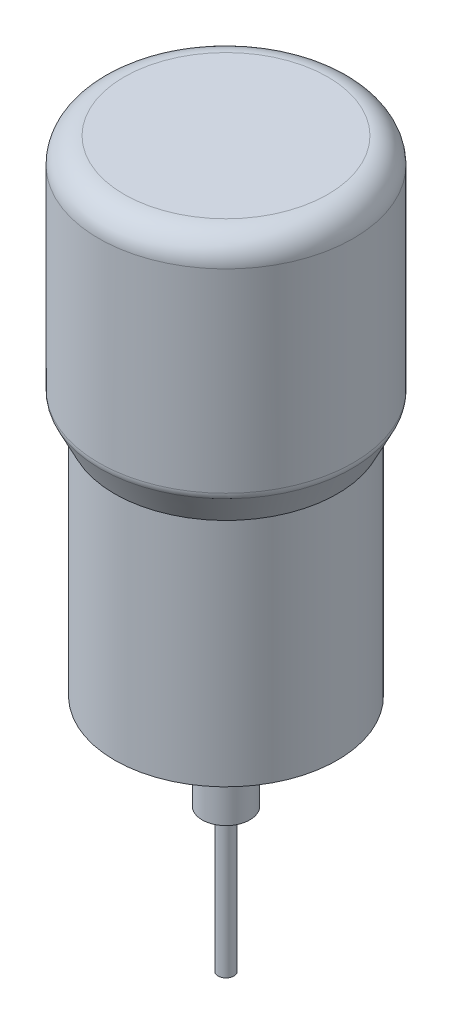
ISO-10303-21;
HEADER;
FILE_DESCRIPTION(('STEP AP214'),'2;1');
FILE_NAME('part.step','',(''),(''),'','','');
FILE_SCHEMA(('AUTOMOTIVE_DESIGN { 1 0 10303 214 1 1 1 1 }'));
ENDSEC;
DATA;
#1=APPLICATION_CONTEXT('core data for automotive mechanical design processes');
#2=APPLICATION_PROTOCOL_DEFINITION('international standard','automotive_design',2000,#1);
#3=PRODUCT_CONTEXT('',#1,'mechanical');
#4=PRODUCT('Part','Part','',(#3));
#5=PRODUCT_RELATED_PRODUCT_CATEGORY('part','',(#4));
#6=PRODUCT_DEFINITION_FORMATION('','',#4);
#7=PRODUCT_DEFINITION_CONTEXT('part definition',#1,'design');
#8=PRODUCT_DEFINITION('design','',#6,#7);
#9=PRODUCT_DEFINITION_SHAPE('','',#8);
#10=(LENGTH_UNIT() NAMED_UNIT(*) SI_UNIT(.MILLI.,.METRE.));
#11=(NAMED_UNIT(*) PLANE_ANGLE_UNIT() SI_UNIT($,.RADIAN.));
#12=(NAMED_UNIT(*) SI_UNIT($,.STERADIAN.) SOLID_ANGLE_UNIT());
#13=UNCERTAINTY_MEASURE_WITH_UNIT(LENGTH_MEASURE(1.E-05),#10,'distance_accuracy_value','');
#14=(GEOMETRIC_REPRESENTATION_CONTEXT(3) GLOBAL_UNCERTAINTY_ASSIGNED_CONTEXT((#13)) GLOBAL_UNIT_ASSIGNED_CONTEXT((#10,
#11,#12)) REPRESENTATION_CONTEXT('',''));
#15=CARTESIAN_POINT('',(0.,0.,0.));
#16=DIRECTION('',(0.,0.,1.));
#17=DIRECTION('',(1.,0.,0.));
#18=AXIS2_PLACEMENT_3D('',#15,#16,#17);
#19=CARTESIAN_POINT('',(0.,-142.875,0.));
#20=DIRECTION('',(0.,-1.,0.));
#21=DIRECTION('',(0.,0.,-1.));
#22=AXIS2_PLACEMENT_3D('',#19,#20,#21);
#23=PLANE('',#22);
#24=CARTESIAN_POINT('',(0.,-142.875,0.));
#25=DIRECTION('',(0.,-1.,0.));
#26=DIRECTION('',(0.,0.,-1.));
#27=AXIS2_PLACEMENT_3D('',#24,#25,#26);
#28=CIRCLE('',#27,9.525);
#29=CARTESIAN_POINT('',(0.,-142.875,9.525));
#30=VERTEX_POINT('',#29);
#31=EDGE_CURVE('E59',#30,#30,#28,.T.);
#32=ORIENTED_EDGE('',*,*,#31,.T.);
#33=EDGE_LOOP('',(#32));
#34=FACE_BOUND('',#33,.T.);
#35=CARTESIAN_POINT('',(0.,-142.875,0.));
#36=DIRECTION('',(0.,-1.,0.));
#37=DIRECTION('',(0.,0.,-1.));
#38=AXIS2_PLACEMENT_3D('',#35,#36,#37);
#39=CIRCLE('',#38,3.175);
#40=CARTESIAN_POINT('',(0.,-142.875,-3.175));
#41=VERTEX_POINT('',#40);
#42=EDGE_CURVE('E66',#41,#41,#39,.T.);
#43=ORIENTED_EDGE('',*,*,#42,.F.);
#44=EDGE_LOOP('',(#43));
#45=FACE_BOUND('',#44,.T.);
#46=ADVANCED_FACE('F33',(#34,#45),#23,.T.);
#47=CARTESIAN_POINT('',(0.,-104.775,0.));
#48=DIRECTION('',(0.,-1.,0.));
#49=DIRECTION('',(0.,0.,-1.));
#50=AXIS2_PLACEMENT_3D('',#47,#48,#49);
#51=PLANE('',#50);
#52=CARTESIAN_POINT('',(0.,-104.775,0.));
#53=DIRECTION('',(0.,-1.,0.));
#54=DIRECTION('',(0.,0.,-1.));
#55=AXIS2_PLACEMENT_3D('',#52,#53,#54);
#56=CIRCLE('',#55,44.45);
#57=CARTESIAN_POINT('',(0.,-104.775,-44.45));
#58=VERTEX_POINT('',#57);
#59=EDGE_CURVE('E54',#58,#58,#56,.T.);
#60=ORIENTED_EDGE('',*,*,#59,.T.);
#61=EDGE_LOOP('',(#60));
#62=FACE_BOUND('',#61,.T.);
#63=CARTESIAN_POINT('',(0.,-104.775,0.));
#64=DIRECTION('',(0.,-1.,0.));
#65=DIRECTION('',(0.,0.,-1.));
#66=AXIS2_PLACEMENT_3D('',#63,#64,#65);
#67=CIRCLE('',#66,9.525);
#68=CARTESIAN_POINT('',(0.,-104.775,9.525));
#69=VERTEX_POINT('',#68);
#70=EDGE_CURVE('E60',#69,#69,#67,.T.);
#71=ORIENTED_EDGE('',*,*,#70,.F.);
#72=EDGE_LOOP('',(#71));
#73=FACE_BOUND('',#72,.T.);
#74=ADVANCED_FACE('F82',(#62,#73),#51,.T.);
#75=CARTESIAN_POINT('',(0.,0.,0.));
#76=DIRECTION('',(0.,1.,0.));
#77=DIRECTION('',(0.,0.,-1.));
#78=AXIS2_PLACEMENT_3D('',#75,#76,#77);
#79=CONICAL_SURFACE('',#78,50.8,0.463647609000806);
#80=CARTESIAN_POINT('',(0.,-1.07261973944084,0.));
#81=DIRECTION('',(0.,-1.,0.));
#82=DIRECTION('',(0.,0.,-1.));
#83=AXIS2_PLACEMENT_3D('',#80,#81,#82);
#84=CIRCLE('',#83,50.2636901302796);
#85=CARTESIAN_POINT('',(0.,-1.07261973944084,-50.2636901302796));
#86=VERTEX_POINT('',#85);
#87=EDGE_CURVE('E40',#86,#86,#84,.T.);
#88=ORIENTED_EDGE('',*,*,#87,.T.);
#89=EDGE_LOOP('',(#88));
#90=FACE_BOUND('',#89,.T.);
#91=CARTESIAN_POINT('',(0.,-12.7,0.));
#92=DIRECTION('',(0.,-1.,0.));
#93=DIRECTION('',(0.,0.,-1.));
#94=AXIS2_PLACEMENT_3D('',#91,#92,#93);
#95=CIRCLE('',#94,44.45);
#96=CARTESIAN_POINT('',(0.,-12.7,-44.45));
#97=VERTEX_POINT('',#96);
#98=EDGE_CURVE('E44',#97,#97,#95,.T.);
#99=ORIENTED_EDGE('',*,*,#98,.F.);
#100=EDGE_LOOP('',(#99));
#101=FACE_BOUND('',#100,.T.);
#102=ADVANCED_FACE('F88',(#90,#101),#79,.T.);
#103=CARTESIAN_POINT('',(0.,78.74,0.));
#104=DIRECTION('',(0.,1.,0.));
#105=DIRECTION('',(1.,0.,0.));
#106=AXIS2_PLACEMENT_3D('',#103,#104,#105);
#107=TOROIDAL_SURFACE('',#106,40.64,10.16);
#108=CARTESIAN_POINT('',(0.,78.74,0.));
#109=DIRECTION('',(0.,1.,0.));
#110=DIRECTION('',(1.,0.,0.));
#111=AXIS2_PLACEMENT_3D('',#108,#109,#110);
#112=CIRCLE('',#111,50.8);
#113=CARTESIAN_POINT('',(50.8,78.74,0.));
#114=VERTEX_POINT('',#113);
#115=EDGE_CURVE('E48',#114,#114,#112,.T.);
#116=ORIENTED_EDGE('',*,*,#115,.T.);
#117=EDGE_LOOP('',(#116));
#118=FACE_BOUND('',#117,.T.);
#119=CARTESIAN_POINT('',(0.,88.9,0.));
#120=DIRECTION('',(0.,-1.,0.));
#121=DIRECTION('',(0.,0.,-1.));
#122=AXIS2_PLACEMENT_3D('',#119,#120,#121);
#123=CIRCLE('',#122,40.64);
#124=CARTESIAN_POINT('',(0.,88.9,-40.64));
#125=VERTEX_POINT('',#124);
#126=EDGE_CURVE('E51',#125,#125,#123,.T.);
#127=ORIENTED_EDGE('',*,*,#126,.T.);
#128=EDGE_LOOP('',(#127));
#129=FACE_BOUND('',#128,.T.);
#130=ADVANCED_FACE('F100',(#118,#129),#107,.T.);
#131=CARTESIAN_POINT('',(0.,0.,0.));
#132=DIRECTION('',(0.,1.,0.));
#133=DIRECTION('',(1.,0.,0.));
#134=AXIS2_PLACEMENT_3D('',#131,#132,#133);
#135=CYLINDRICAL_SURFACE('',#134,50.8);
#136=CARTESIAN_POINT('',(0.,1.19922532569895,0.));
#137=DIRECTION('',(0.,1.,0.));
#138=DIRECTION('',(0.,0.,1.));
#139=AXIS2_PLACEMENT_3D('',#136,#137,#138);
#140=CIRCLE('',#139,50.8);
#141=CARTESIAN_POINT('',(0.,1.19922532569895,50.8));
#142=VERTEX_POINT('',#141);
#143=EDGE_CURVE('E10',#142,#142,#140,.T.);
#144=ORIENTED_EDGE('',*,*,#143,.T.);
#145=EDGE_LOOP('',(#144));
#146=FACE_BOUND('',#145,.T.);
#147=ORIENTED_EDGE('',*,*,#115,.F.);
#148=EDGE_LOOP('',(#147));
#149=FACE_BOUND('',#148,.T.);
#150=ADVANCED_FACE('F103',(#146,#149),#135,.T.);
#151=CARTESIAN_POINT('',(0.,88.9,0.));
#152=DIRECTION('',(0.,1.,0.));
#153=DIRECTION('',(0.,0.,1.));
#154=AXIS2_PLACEMENT_3D('',#151,#152,#153);
#155=PLANE('',#154);
#156=ORIENTED_EDGE('',*,*,#126,.F.);
#157=EDGE_LOOP('',(#156));
#158=FACE_BOUND('',#157,.T.);
#159=ADVANCED_FACE('F105',(#158),#155,.T.);
#160=CARTESIAN_POINT('',(0.,1.19922532569895,0.));
#161=DIRECTION('',(0.,1.,0.));
#162=DIRECTION('',(0.,0.,1.));
#163=AXIS2_PLACEMENT_3D('',#160,#161,#162);
#164=TOROIDAL_SURFACE('',#163,45.72,5.08);
#165=ORIENTED_EDGE('',*,*,#143,.F.);
#166=EDGE_LOOP('',(#165));
#167=FACE_BOUND('',#166,.T.);
#168=ORIENTED_EDGE('',*,*,#87,.F.);
#169=EDGE_LOOP('',(#168));
#170=FACE_BOUND('',#169,.T.);
#171=ADVANCED_FACE('F35',(#167,#170),#164,.T.);
#172=CARTESIAN_POINT('',(0.,-104.775,0.));
#173=DIRECTION('',(0.,1.,0.));
#174=DIRECTION('',(0.,0.,1.));
#175=AXIS2_PLACEMENT_3D('',#172,#173,#174);
#176=CYLINDRICAL_SURFACE('',#175,44.45);
#177=ORIENTED_EDGE('',*,*,#59,.F.);
#178=EDGE_LOOP('',(#177));
#179=FACE_BOUND('',#178,.T.);
#180=ORIENTED_EDGE('',*,*,#98,.T.);
#181=EDGE_LOOP('',(#180));
#182=FACE_BOUND('',#181,.T.);
#183=ADVANCED_FACE('F94',(#179,#182),#176,.T.);
#184=CARTESIAN_POINT('',(0.,-142.875,0.));
#185=DIRECTION('',(0.,1.,0.));
#186=DIRECTION('',(0.,0.,1.));
#187=AXIS2_PLACEMENT_3D('',#184,#185,#186);
#188=CYLINDRICAL_SURFACE('',#187,9.525);
#189=CARTESIAN_POINT('',(0.,-142.875,9.525));
#190=CARTESIAN_POINT('',(0.,-142.478125,9.525));
#191=CARTESIAN_POINT('',(0.,-142.08125,9.525));
#192=CARTESIAN_POINT('',(0.,-141.2875,9.525));
#193=CARTESIAN_POINT('',(0.,-140.890625,9.525));
#194=CARTESIAN_POINT('',(0.,-140.096875,9.525));
#195=CARTESIAN_POINT('',(0.,-139.7,9.525));
#196=CARTESIAN_POINT('',(0.,-138.90625,9.525));
#197=CARTESIAN_POINT('',(0.,-138.509375,9.525));
#198=CARTESIAN_POINT('',(0.,-137.715625,9.525));
#199=CARTESIAN_POINT('',(0.,-137.31875,9.525));
#200=CARTESIAN_POINT('',(0.,-136.525,9.525));
#201=CARTESIAN_POINT('',(0.,-136.128125,9.525));
#202=CARTESIAN_POINT('',(0.,-135.334375,9.525));
#203=CARTESIAN_POINT('',(0.,-134.9375,9.525));
#204=CARTESIAN_POINT('',(0.,-134.14375,9.525));
#205=CARTESIAN_POINT('',(0.,-133.746875,9.525));
#206=CARTESIAN_POINT('',(0.,-132.953125,9.525));
#207=CARTESIAN_POINT('',(0.,-132.55625,9.525));
#208=CARTESIAN_POINT('',(0.,-131.7625,9.525));
#209=CARTESIAN_POINT('',(0.,-131.365625,9.525));
#210=CARTESIAN_POINT('',(0.,-130.571875,9.525));
#211=CARTESIAN_POINT('',(0.,-130.175,9.525));
#212=CARTESIAN_POINT('',(0.,-129.38125,9.525));
#213=CARTESIAN_POINT('',(0.,-128.984375,9.525));
#214=CARTESIAN_POINT('',(0.,-128.190625,9.525));
#215=CARTESIAN_POINT('',(0.,-127.79375,9.525));
#216=CARTESIAN_POINT('',(0.,-127.,9.525));
#217=CARTESIAN_POINT('',(0.,-126.603125,9.525));
#218=CARTESIAN_POINT('',(0.,-125.809375,9.525));
#219=CARTESIAN_POINT('',(0.,-125.4125,9.525));
#220=CARTESIAN_POINT('',(0.,-124.61875,9.525));
#221=CARTESIAN_POINT('',(0.,-124.221875,9.525));
#222=CARTESIAN_POINT('',(0.,-123.428125,9.525));
#223=CARTESIAN_POINT('',(0.,-123.03125,9.525));
#224=CARTESIAN_POINT('',(0.,-122.2375,9.525));
#225=CARTESIAN_POINT('',(0.,-121.840625,9.525));
#226=CARTESIAN_POINT('',(0.,-121.046875,9.525));
#227=CARTESIAN_POINT('',(0.,-120.65,9.525));
#228=CARTESIAN_POINT('',(0.,-119.85625,9.525));
#229=CARTESIAN_POINT('',(0.,-119.459375,9.525));
#230=CARTESIAN_POINT('',(0.,-118.665625,9.525));
#231=CARTESIAN_POINT('',(0.,-118.26875,9.525));
#232=CARTESIAN_POINT('',(0.,-117.475,9.525));
#233=CARTESIAN_POINT('',(0.,-117.078125,9.525));
#234=CARTESIAN_POINT('',(0.,-116.284375,9.525));
#235=CARTESIAN_POINT('',(0.,-115.8875,9.525));
#236=CARTESIAN_POINT('',(0.,-115.09375,9.525));
#237=CARTESIAN_POINT('',(0.,-114.696875,9.525));
#238=CARTESIAN_POINT('',(0.,-113.903125,9.525));
#239=CARTESIAN_POINT('',(0.,-113.50625,9.525));
#240=CARTESIAN_POINT('',(0.,-112.7125,9.525));
#241=CARTESIAN_POINT('',(0.,-112.315625,9.525));
#242=CARTESIAN_POINT('',(0.,-111.521875,9.525));
#243=CARTESIAN_POINT('',(0.,-111.125,9.525));
#244=CARTESIAN_POINT('',(0.,-110.33125,9.525));
#245=CARTESIAN_POINT('',(0.,-109.934375,9.525));
#246=CARTESIAN_POINT('',(0.,-109.140625,9.525));
#247=CARTESIAN_POINT('',(0.,-108.74375,9.525));
#248=CARTESIAN_POINT('',(0.,-107.95,9.525));
#249=CARTESIAN_POINT('',(0.,-107.553125,9.525));
#250=CARTESIAN_POINT('',(0.,-106.759375,9.525));
#251=CARTESIAN_POINT('',(0.,-106.3625,9.525));
#252=CARTESIAN_POINT('',(0.,-105.56875,9.525));
#253=CARTESIAN_POINT('',(0.,-105.171875,9.525));
#254=CARTESIAN_POINT('',(0.,-104.775,9.525));
#255=B_SPLINE_CURVE_WITH_KNOTS('',3,(#189,#190,#191,#192,#193,#194,#195,#196,#197,#198,#199,
#200,#201,#202,#203,#204,#205,#206,#207,#208,#209,#210,#211,#212,#213,#214,#215,#216,#217,#218,
#219,#220,#221,#222,#223,#224,#225,#226,#227,#228,#229,#230,#231,#232,#233,#234,#235,#236,#237,
#238,#239,#240,#241,#242,#243,#244,#245,#246,#247,#248,#249,#250,#251,#252,#253,#254),
.UNSPECIFIED.,.F.,.F.,(4,2,2,2,2,2,2,2,2,2,2,2,2,2,2,2,2,2,2,2,2,2,2,2,2,2,2,2,2,2,2,2,4),(0.,
1.19062499999997,2.38124999999997,3.57187499999997,4.76249999999998,5.95312499999998,
7.14374999999998,8.33437499999998,9.52499999999998,10.715625,11.90625,13.096875,14.2875,
15.478125,16.66875,17.859375,19.05,20.240625,21.43125,22.621875,23.8125,25.003125,26.19375,
27.384375,28.575,29.765625,30.95625,32.146875,33.3375,34.528125,35.71875,36.909375,38.1),.UNSPECIFIED.);
#256=EDGE_CURVE('BSEAM77',#30,#69,#255,.T.);
#257=ORIENTED_EDGE('',*,*,#31,.F.);
#258=ORIENTED_EDGE('',*,*,#70,.T.);
#259=ORIENTED_EDGE('',*,*,#256,.T.);
#260=ORIENTED_EDGE('',*,*,#256,.F.);
#261=EDGE_LOOP('',(#257,#259,#258,#260));
#262=FACE_BOUND('',#261,.T.);
#263=ADVANCED_FACE('F77',(#262),#188,.T.);
#264=CARTESIAN_POINT('',(0.,-200.025,0.));
#265=DIRECTION('',(0.,1.,0.));
#266=DIRECTION('',(0.,0.,1.));
#267=AXIS2_PLACEMENT_3D('',#264,#265,#266);
#268=CYLINDRICAL_SURFACE('',#267,3.175);
#269=CARTESIAN_POINT('',(0.,-200.025,0.));
#270=DIRECTION('',(0.,-1.,0.));
#271=DIRECTION('',(0.,0.,-1.));
#272=AXIS2_PLACEMENT_3D('',#269,#270,#271);
#273=CIRCLE('',#272,3.175);
#274=CARTESIAN_POINT('',(0.,-200.025,-3.175));
#275=VERTEX_POINT('',#274);
#276=EDGE_CURVE('E63',#275,#275,#273,.T.);
#277=ORIENTED_EDGE('',*,*,#276,.F.);
#278=EDGE_LOOP('',(#277));
#279=FACE_BOUND('',#278,.T.);
#280=ORIENTED_EDGE('',*,*,#42,.T.);
#281=EDGE_LOOP('',(#280));
#282=FACE_BOUND('',#281,.T.);
#283=ADVANCED_FACE('F74',(#279,#282),#268,.T.);
#284=CARTESIAN_POINT('',(0.,-200.025,0.));
#285=DIRECTION('',(0.,-1.,0.));
#286=DIRECTION('',(0.,0.,-1.));
#287=AXIS2_PLACEMENT_3D('',#284,#285,#286);
#288=PLANE('',#287);
#289=ORIENTED_EDGE('',*,*,#276,.T.);
#290=EDGE_LOOP('',(#289));
#291=FACE_BOUND('',#290,.T.);
#292=ADVANCED_FACE('F72',(#291),#288,.T.);
#293=CLOSED_SHELL('',(#46,#74,#102,#130,#150,#159,#171,#183,#263,#283,#292));
#294=MANIFOLD_SOLID_BREP('B2',#293);
#295=ADVANCED_BREP_SHAPE_REPRESENTATION('',(#18,#294),#14);
#296=SHAPE_DEFINITION_REPRESENTATION(#9,#295);
ENDSEC;
END-ISO-10303-21;
